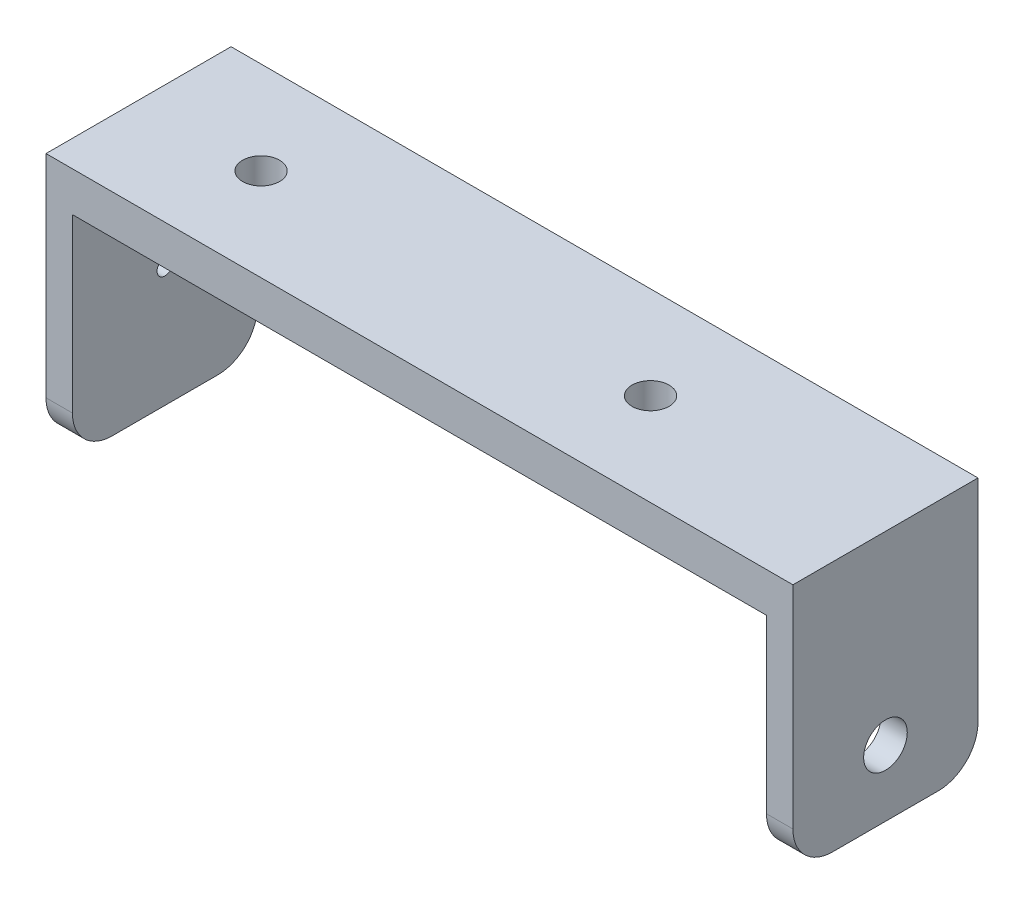
ISO-10303-21;
HEADER;
FILE_DESCRIPTION(('STEP AP214'),'2;1');
FILE_NAME('part.step','',(''),(''),'','','');
FILE_SCHEMA(('AUTOMOTIVE_DESIGN { 1 0 10303 214 1 1 1 1 }'));
ENDSEC;
DATA;
#1=APPLICATION_CONTEXT('core data for automotive mechanical design processes');
#2=APPLICATION_PROTOCOL_DEFINITION('international standard','automotive_design',2000,#1);
#3=PRODUCT_CONTEXT('',#1,'mechanical');
#4=PRODUCT('Part','Part','',(#3));
#5=PRODUCT_RELATED_PRODUCT_CATEGORY('part','',(#4));
#6=PRODUCT_DEFINITION_FORMATION('','',#4);
#7=PRODUCT_DEFINITION_CONTEXT('part definition',#1,'design');
#8=PRODUCT_DEFINITION('design','',#6,#7);
#9=PRODUCT_DEFINITION_SHAPE('','',#8);
#10=(LENGTH_UNIT() NAMED_UNIT(*) SI_UNIT(.MILLI.,.METRE.));
#11=(NAMED_UNIT(*) PLANE_ANGLE_UNIT() SI_UNIT($,.RADIAN.));
#12=(NAMED_UNIT(*) SI_UNIT($,.STERADIAN.) SOLID_ANGLE_UNIT());
#13=UNCERTAINTY_MEASURE_WITH_UNIT(LENGTH_MEASURE(1.E-05),#10,'distance_accuracy_value','');
#14=(GEOMETRIC_REPRESENTATION_CONTEXT(3) GLOBAL_UNCERTAINTY_ASSIGNED_CONTEXT((#13)) GLOBAL_UNIT_ASSIGNED_CONTEXT((#10,
#11,#12)) REPRESENTATION_CONTEXT('',''));
#15=CARTESIAN_POINT('',(0.,0.,0.));
#16=DIRECTION('',(0.,0.,1.));
#17=DIRECTION('',(1.,0.,0.));
#18=AXIS2_PLACEMENT_3D('',#15,#16,#17);
#19=CARTESIAN_POINT('',(0.,16.,14.));
#20=DIRECTION('',(0.,-1.,0.));
#21=DIRECTION('',(1.,0.,0.));
#22=AXIS2_PLACEMENT_3D('',#19,#20,#21);
#23=PLANE('',#22);
#24=CARTESIAN_POINT('',(-18.98,16.,7.));
#25=DIRECTION('',(0.,-1.,0.));
#26=DIRECTION('',(1.,0.,0.));
#27=AXIS2_PLACEMENT_3D('',#24,#25,#26);
#28=CIRCLE('',#27,1.4);
#29=CARTESIAN_POINT('',(-17.58,16.,7.));
#30=VERTEX_POINT('',#29);
#31=EDGE_CURVE('E297',#30,#30,#28,.T.);
#32=ORIENTED_EDGE('',*,*,#31,.F.);
#33=EDGE_LOOP('',(#32));
#34=FACE_BOUND('',#33,.T.);
#35=CARTESIAN_POINT('',(10.48,16.,7.));
#36=DIRECTION('',(0.,-1.,0.));
#37=DIRECTION('',(1.,0.,0.));
#38=AXIS2_PLACEMENT_3D('',#35,#36,#37);
#39=CIRCLE('',#38,1.4);
#40=CARTESIAN_POINT('',(11.88,16.,7.));
#41=VERTEX_POINT('',#40);
#42=EDGE_CURVE('E290',#41,#41,#39,.T.);
#43=ORIENTED_EDGE('',*,*,#42,.F.);
#44=EDGE_LOOP('',(#43));
#45=FACE_BOUND('',#44,.T.);
#46=DIRECTION('',(-1.,0.,0.));
#47=VECTOR('',#46,1.);
#48=CARTESIAN_POINT('',(0.,16.,0.));
#49=LINE('',#48,#47);
#50=CARTESIAN_POINT('',(26.25,16.,0.));
#51=VERTEX_POINT('',#50);
#52=CARTESIAN_POINT('',(-26.25,16.,0.));
#53=VERTEX_POINT('',#52);
#54=EDGE_CURVE('E156',#51,#53,#49,.T.);
#55=ORIENTED_EDGE('',*,*,#54,.F.);
#56=DIRECTION('',(0.,0.,-1.));
#57=VECTOR('',#56,1.);
#58=CARTESIAN_POINT('',(26.25,16.,14.));
#59=LINE('',#58,#57);
#60=CARTESIAN_POINT('',(26.25,16.,14.));
#61=VERTEX_POINT('',#60);
#62=EDGE_CURVE('E142',#61,#51,#59,.T.);
#63=ORIENTED_EDGE('',*,*,#62,.F.);
#64=DIRECTION('',(-1.,0.,0.));
#65=VECTOR('',#64,1.);
#66=CARTESIAN_POINT('',(0.,16.,14.));
#67=LINE('',#66,#65);
#68=CARTESIAN_POINT('',(-26.25,16.,14.));
#69=VERTEX_POINT('',#68);
#70=EDGE_CURVE('E150',#61,#69,#67,.T.);
#71=ORIENTED_EDGE('',*,*,#70,.T.);
#72=DIRECTION('',(0.,0.,-1.));
#73=VECTOR('',#72,1.);
#74=CARTESIAN_POINT('',(-26.25,16.,14.));
#75=LINE('',#74,#73);
#76=EDGE_CURVE('E186',#69,#53,#75,.T.);
#77=ORIENTED_EDGE('',*,*,#76,.T.);
#78=EDGE_LOOP('',(#55,#63,#71,#77));
#79=FACE_BOUND('',#78,.T.);
#80=ADVANCED_FACE('F43',(#34,#45,#79),#23,.T.);
#81=CARTESIAN_POINT('',(26.25,0.,14.));
#82=DIRECTION('',(-1.,0.,0.));
#83=DIRECTION('',(0.,0.,1.));
#84=AXIS2_PLACEMENT_3D('',#81,#82,#83);
#85=PLANE('',#84);
#86=CARTESIAN_POINT('',(26.25,5.00000000000001,7.));
#87=DIRECTION('',(-1.,0.,0.));
#88=DIRECTION('',(0.,0.,1.));
#89=AXIS2_PLACEMENT_3D('',#86,#87,#88);
#90=CIRCLE('',#89,1.65);
#91=CARTESIAN_POINT('',(26.25,5.00000000000001,8.65));
#92=VERTEX_POINT('',#91);
#93=EDGE_CURVE('E171',#92,#92,#90,.F.);
#94=ORIENTED_EDGE('',*,*,#93,.T.);
#95=EDGE_LOOP('',(#94));
#96=FACE_BOUND('',#95,.T.);
#97=DIRECTION('',(0.,0.,-1.));
#98=VECTOR('',#97,1.);
#99=CARTESIAN_POINT('',(26.25,0.,14.));
#100=LINE('',#99,#98);
#101=CARTESIAN_POINT('',(26.25,0.,11.));
#102=VERTEX_POINT('',#101);
#103=CARTESIAN_POINT('',(26.25,0.,3.));
#104=VERTEX_POINT('',#103);
#105=EDGE_CURVE('E159',#102,#104,#100,.T.);
#106=ORIENTED_EDGE('',*,*,#105,.F.);
#107=CARTESIAN_POINT('',(26.25,3.,11.));
#108=DIRECTION('',(-1.,0.,0.));
#109=DIRECTION('',(0.,0.,1.));
#110=AXIS2_PLACEMENT_3D('',#107,#108,#109);
#111=CIRCLE('',#110,3.);
#112=CARTESIAN_POINT('',(26.25,3.,14.));
#113=VERTEX_POINT('',#112);
#114=EDGE_CURVE('E144',#102,#113,#111,.T.);
#115=ORIENTED_EDGE('',*,*,#114,.T.);
#116=DIRECTION('',(0.,1.,0.));
#117=VECTOR('',#116,1.);
#118=CARTESIAN_POINT('',(26.25,0.,14.));
#119=LINE('',#118,#117);
#120=EDGE_CURVE('E137',#113,#61,#119,.T.);
#121=ORIENTED_EDGE('',*,*,#120,.T.);
#122=ORIENTED_EDGE('',*,*,#62,.T.);
#123=DIRECTION('',(0.,1.,0.));
#124=VECTOR('',#123,1.);
#125=CARTESIAN_POINT('',(26.25,0.,0.));
#126=LINE('',#125,#124);
#127=CARTESIAN_POINT('',(26.25,3.,0.));
#128=VERTEX_POINT('',#127);
#129=EDGE_CURVE('E189',#128,#51,#126,.T.);
#130=ORIENTED_EDGE('',*,*,#129,.F.);
#131=CARTESIAN_POINT('',(26.25,3.,3.));
#132=DIRECTION('',(-1.,0.,0.));
#133=DIRECTION('',(0.,0.,1.));
#134=AXIS2_PLACEMENT_3D('',#131,#132,#133);
#135=CIRCLE('',#134,3.);
#136=EDGE_CURVE('E231',#128,#104,#135,.T.);
#137=ORIENTED_EDGE('',*,*,#136,.T.);
#138=EDGE_LOOP('',(#106,#115,#121,#122,#130,#137));
#139=FACE_BOUND('',#138,.T.);
#140=ADVANCED_FACE('F140',(#96,#139),#85,.T.);
#141=CARTESIAN_POINT('',(0.,0.,14.));
#142=DIRECTION('',(0.,-1.,0.));
#143=DIRECTION('',(1.,0.,0.));
#144=AXIS2_PLACEMENT_3D('',#141,#142,#143);
#145=PLANE('',#144);
#146=DIRECTION('',(0.,0.,-1.));
#147=VECTOR('',#146,1.);
#148=CARTESIAN_POINT('',(28.25,0.,14.));
#149=LINE('',#148,#147);
#150=CARTESIAN_POINT('',(28.25,0.,11.));
#151=VERTEX_POINT('',#150);
#152=CARTESIAN_POINT('',(28.25,0.,3.));
#153=VERTEX_POINT('',#152);
#154=EDGE_CURVE('E218',#151,#153,#149,.T.);
#155=ORIENTED_EDGE('',*,*,#154,.F.);
#156=DIRECTION('',(-1.,0.,0.));
#157=VECTOR('',#156,1.);
#158=CARTESIAN_POINT('',(0.,0.,11.));
#159=LINE('',#158,#157);
#160=EDGE_CURVE('E227',#151,#102,#159,.T.);
#161=ORIENTED_EDGE('',*,*,#160,.T.);
#162=ORIENTED_EDGE('',*,*,#105,.T.);
#163=DIRECTION('',(-1.,0.,0.));
#164=VECTOR('',#163,1.);
#165=CARTESIAN_POINT('',(28.25,0.,3.));
#166=LINE('',#165,#164);
#167=EDGE_CURVE('E158',#104,#153,#166,.F.);
#168=ORIENTED_EDGE('',*,*,#167,.T.);
#169=EDGE_LOOP('',(#155,#161,#162,#168));
#170=FACE_BOUND('',#169,.T.);
#171=ADVANCED_FACE('F331',(#170),#145,.T.);
#172=CARTESIAN_POINT('',(28.25,0.,14.));
#173=DIRECTION('',(1.,0.,0.));
#174=DIRECTION('',(0.,1.,0.));
#175=AXIS2_PLACEMENT_3D('',#172,#173,#174);
#176=PLANE('',#175);
#177=CARTESIAN_POINT('',(28.25,5.00000000000001,7.));
#178=DIRECTION('',(1.,0.,0.));
#179=DIRECTION('',(0.,0.,-1.));
#180=AXIS2_PLACEMENT_3D('',#177,#178,#179);
#181=CIRCLE('',#180,1.65);
#182=CARTESIAN_POINT('',(28.25,5.00000000000001,5.35));
#183=VERTEX_POINT('',#182);
#184=EDGE_CURVE('E300',#183,#183,#181,.T.);
#185=ORIENTED_EDGE('',*,*,#184,.F.);
#186=EDGE_LOOP('',(#185));
#187=FACE_BOUND('',#186,.T.);
#188=DIRECTION('',(0.,-1.,0.));
#189=VECTOR('',#188,1.);
#190=CARTESIAN_POINT('',(28.25,0.,14.));
#191=LINE('',#190,#189);
#192=CARTESIAN_POINT('',(28.25,19.,14.));
#193=VERTEX_POINT('',#192);
#194=CARTESIAN_POINT('',(28.25,3.,14.));
#195=VERTEX_POINT('',#194);
#196=EDGE_CURVE('E149',#193,#195,#191,.T.);
#197=ORIENTED_EDGE('',*,*,#196,.T.);
#198=CARTESIAN_POINT('',(28.25,3.,11.));
#199=DIRECTION('',(1.,0.,0.));
#200=DIRECTION('',(0.,1.,0.));
#201=AXIS2_PLACEMENT_3D('',#198,#199,#200);
#202=CIRCLE('',#201,3.);
#203=EDGE_CURVE('E245',#195,#151,#202,.T.);
#204=ORIENTED_EDGE('',*,*,#203,.T.);
#205=ORIENTED_EDGE('',*,*,#154,.T.);
#206=CARTESIAN_POINT('',(28.25,3.,3.));
#207=DIRECTION('',(1.,0.,0.));
#208=DIRECTION('',(0.,1.,0.));
#209=AXIS2_PLACEMENT_3D('',#206,#207,#208);
#210=CIRCLE('',#209,3.);
#211=CARTESIAN_POINT('',(28.25,3.,0.));
#212=VERTEX_POINT('',#211);
#213=EDGE_CURVE('E242',#153,#212,#210,.T.);
#214=ORIENTED_EDGE('',*,*,#213,.T.);
#215=DIRECTION('',(0.,-1.,0.));
#216=VECTOR('',#215,1.);
#217=CARTESIAN_POINT('',(28.25,0.,0.));
#218=LINE('',#217,#216);
#219=CARTESIAN_POINT('',(28.25,19.,0.));
#220=VERTEX_POINT('',#219);
#221=EDGE_CURVE('E192',#220,#212,#218,.T.);
#222=ORIENTED_EDGE('',*,*,#221,.F.);
#223=DIRECTION('',(0.,0.,-1.));
#224=VECTOR('',#223,1.);
#225=CARTESIAN_POINT('',(28.25,19.,14.));
#226=LINE('',#225,#224);
#227=EDGE_CURVE('E215',#193,#220,#226,.T.);
#228=ORIENTED_EDGE('',*,*,#227,.F.);
#229=EDGE_LOOP('',(#197,#204,#205,#214,#222,#228));
#230=FACE_BOUND('',#229,.T.);
#231=ADVANCED_FACE('F371',(#187,#230),#176,.T.);
#232=CARTESIAN_POINT('',(0.,19.,14.));
#233=DIRECTION('',(0.,1.,0.));
#234=DIRECTION('',(0.,0.,1.));
#235=AXIS2_PLACEMENT_3D('',#232,#233,#234);
#236=PLANE('',#235);
#237=CARTESIAN_POINT('',(-18.98,19.,7.));
#238=DIRECTION('',(0.,1.,0.));
#239=DIRECTION('',(0.,0.,1.));
#240=AXIS2_PLACEMENT_3D('',#237,#238,#239);
#241=CIRCLE('',#240,1.4);
#242=CARTESIAN_POINT('',(-18.98,19.,8.4));
#243=VERTEX_POINT('',#242);
#244=EDGE_CURVE('E286',#243,#243,#241,.T.);
#245=ORIENTED_EDGE('',*,*,#244,.F.);
#246=EDGE_LOOP('',(#245));
#247=FACE_BOUND('',#246,.T.);
#248=CARTESIAN_POINT('',(10.48,19.,7.));
#249=DIRECTION('',(0.,1.,0.));
#250=DIRECTION('',(0.,0.,1.));
#251=AXIS2_PLACEMENT_3D('',#248,#249,#250);
#252=CIRCLE('',#251,1.4);
#253=CARTESIAN_POINT('',(10.48,19.,8.4));
#254=VERTEX_POINT('',#253);
#255=EDGE_CURVE('E276',#254,#254,#252,.T.);
#256=ORIENTED_EDGE('',*,*,#255,.F.);
#257=EDGE_LOOP('',(#256));
#258=FACE_BOUND('',#257,.T.);
#259=DIRECTION('',(1.,0.,0.));
#260=VECTOR('',#259,1.);
#261=CARTESIAN_POINT('',(0.,19.,0.));
#262=LINE('',#261,#260);
#263=CARTESIAN_POINT('',(-28.25,19.,0.));
#264=VERTEX_POINT('',#263);
#265=EDGE_CURVE('E196',#264,#220,#262,.T.);
#266=ORIENTED_EDGE('',*,*,#265,.F.);
#267=DIRECTION('',(0.,0.,-1.));
#268=VECTOR('',#267,1.);
#269=CARTESIAN_POINT('',(-28.25,19.,14.));
#270=LINE('',#269,#268);
#271=CARTESIAN_POINT('',(-28.25,19.,14.));
#272=VERTEX_POINT('',#271);
#273=EDGE_CURVE('E211',#272,#264,#270,.T.);
#274=ORIENTED_EDGE('',*,*,#273,.F.);
#275=DIRECTION('',(1.,0.,0.));
#276=VECTOR('',#275,1.);
#277=CARTESIAN_POINT('',(0.,19.,14.));
#278=LINE('',#277,#276);
#279=EDGE_CURVE('E177',#272,#193,#278,.T.);
#280=ORIENTED_EDGE('',*,*,#279,.T.);
#281=ORIENTED_EDGE('',*,*,#227,.T.);
#282=EDGE_LOOP('',(#266,#274,#280,#281));
#283=FACE_BOUND('',#282,.T.);
#284=ADVANCED_FACE('F360',(#247,#258,#283),#236,.T.);
#285=CARTESIAN_POINT('',(-28.25,0.,14.));
#286=DIRECTION('',(-1.,0.,0.));
#287=DIRECTION('',(0.,0.,1.));
#288=AXIS2_PLACEMENT_3D('',#285,#286,#287);
#289=PLANE('',#288);
#290=CARTESIAN_POINT('',(-28.25,9.08500000000001,7.));
#291=DIRECTION('',(-1.,0.,0.));
#292=DIRECTION('',(0.,0.,1.));
#293=AXIS2_PLACEMENT_3D('',#290,#291,#292);
#294=CIRCLE('',#293,0.6);
#295=CARTESIAN_POINT('',(-28.25,9.08500000000001,7.6));
#296=VERTEX_POINT('',#295);
#297=EDGE_CURVE('E270',#296,#296,#294,.T.);
#298=ORIENTED_EDGE('',*,*,#297,.F.);
#299=EDGE_LOOP('',(#298));
#300=FACE_BOUND('',#299,.T.);
#301=CARTESIAN_POINT('',(-28.25,13.085,7.));
#302=DIRECTION('',(-1.,0.,0.));
#303=DIRECTION('',(0.,0.,1.));
#304=AXIS2_PLACEMENT_3D('',#301,#302,#303);
#305=CIRCLE('',#304,0.6);
#306=CARTESIAN_POINT('',(-28.25,13.085,7.6));
#307=VERTEX_POINT('',#306);
#308=EDGE_CURVE('E278',#307,#307,#305,.T.);
#309=ORIENTED_EDGE('',*,*,#308,.F.);
#310=EDGE_LOOP('',(#309));
#311=FACE_BOUND('',#310,.T.);
#312=DIRECTION('',(0.,0.,-1.));
#313=VECTOR('',#312,1.);
#314=CARTESIAN_POINT('',(-28.25,0.,14.));
#315=LINE('',#314,#313);
#316=CARTESIAN_POINT('',(-28.25,0.,11.));
#317=VERTEX_POINT('',#316);
#318=CARTESIAN_POINT('',(-28.25,0.,3.));
#319=VERTEX_POINT('',#318);
#320=EDGE_CURVE('E207',#317,#319,#315,.T.);
#321=ORIENTED_EDGE('',*,*,#320,.F.);
#322=CARTESIAN_POINT('',(-28.25,2.99999999999996,11.));
#323=DIRECTION('',(-1.,0.,0.));
#324=DIRECTION('',(0.,0.,1.));
#325=AXIS2_PLACEMENT_3D('',#322,#323,#324);
#326=CIRCLE('',#325,3.);
#327=CARTESIAN_POINT('',(-28.25,2.99999999999996,14.));
#328=VERTEX_POINT('',#327);
#329=EDGE_CURVE('E257',#317,#328,#326,.T.);
#330=ORIENTED_EDGE('',*,*,#329,.T.);
#331=DIRECTION('',(0.,1.,0.));
#332=VECTOR('',#331,1.);
#333=CARTESIAN_POINT('',(-28.25,0.,14.));
#334=LINE('',#333,#332);
#335=EDGE_CURVE('E181',#328,#272,#334,.T.);
#336=ORIENTED_EDGE('',*,*,#335,.T.);
#337=ORIENTED_EDGE('',*,*,#273,.T.);
#338=DIRECTION('',(0.,1.,0.));
#339=VECTOR('',#338,1.);
#340=CARTESIAN_POINT('',(-28.25,0.,0.));
#341=LINE('',#340,#339);
#342=CARTESIAN_POINT('',(-28.25,2.99999999999996,0.));
#343=VERTEX_POINT('',#342);
#344=EDGE_CURVE('E168',#343,#264,#341,.T.);
#345=ORIENTED_EDGE('',*,*,#344,.F.);
#346=CARTESIAN_POINT('',(-28.25,2.99999999999996,3.));
#347=DIRECTION('',(-1.,0.,0.));
#348=DIRECTION('',(0.,0.,1.));
#349=AXIS2_PLACEMENT_3D('',#346,#347,#348);
#350=CIRCLE('',#349,3.);
#351=EDGE_CURVE('E69',#343,#319,#350,.T.);
#352=ORIENTED_EDGE('',*,*,#351,.T.);
#353=EDGE_LOOP('',(#321,#330,#336,#337,#345,#352));
#354=FACE_BOUND('',#353,.T.);
#355=ADVANCED_FACE('F354',(#300,#311,#354),#289,.T.);
#356=CARTESIAN_POINT('',(0.,0.,14.));
#357=DIRECTION('',(0.,-1.,0.));
#358=DIRECTION('',(1.,0.,0.));
#359=AXIS2_PLACEMENT_3D('',#356,#357,#358);
#360=PLANE('',#359);
#361=DIRECTION('',(0.,0.,-1.));
#362=VECTOR('',#361,1.);
#363=CARTESIAN_POINT('',(-26.25,0.,14.));
#364=LINE('',#363,#362);
#365=CARTESIAN_POINT('',(-26.25,0.,11.));
#366=VERTEX_POINT('',#365);
#367=CARTESIAN_POINT('',(-26.25,0.,3.));
#368=VERTEX_POINT('',#367);
#369=EDGE_CURVE('E204',#366,#368,#364,.T.);
#370=ORIENTED_EDGE('',*,*,#369,.F.);
#371=DIRECTION('',(-1.,0.,0.));
#372=VECTOR('',#371,1.);
#373=CARTESIAN_POINT('',(0.,0.,11.));
#374=LINE('',#373,#372);
#375=EDGE_CURVE('E251',#366,#317,#374,.T.);
#376=ORIENTED_EDGE('',*,*,#375,.T.);
#377=ORIENTED_EDGE('',*,*,#320,.T.);
#378=DIRECTION('',(-1.,0.,0.));
#379=VECTOR('',#378,1.);
#380=CARTESIAN_POINT('',(-26.25,0.,3.));
#381=LINE('',#380,#379);
#382=EDGE_CURVE('E248',#319,#368,#381,.F.);
#383=ORIENTED_EDGE('',*,*,#382,.T.);
#384=EDGE_LOOP('',(#370,#376,#377,#383));
#385=FACE_BOUND('',#384,.T.);
#386=ADVANCED_FACE('F384',(#385),#360,.T.);
#387=CARTESIAN_POINT('',(-26.25,0.,14.));
#388=DIRECTION('',(1.,0.,0.));
#389=DIRECTION('',(0.,1.,0.));
#390=AXIS2_PLACEMENT_3D('',#387,#388,#389);
#391=PLANE('',#390);
#392=CARTESIAN_POINT('',(-26.25,9.08500000000001,7.));
#393=DIRECTION('',(1.,0.,0.));
#394=DIRECTION('',(0.,1.,0.));
#395=AXIS2_PLACEMENT_3D('',#392,#393,#394);
#396=CIRCLE('',#395,0.6);
#397=CARTESIAN_POINT('',(-26.25,9.68500000000001,7.));
#398=VERTEX_POINT('',#397);
#399=EDGE_CURVE('E47',#398,#398,#396,.T.);
#400=ORIENTED_EDGE('',*,*,#399,.F.);
#401=EDGE_LOOP('',(#400));
#402=FACE_BOUND('',#401,.T.);
#403=CARTESIAN_POINT('',(-26.25,13.085,7.));
#404=DIRECTION('',(1.,0.,0.));
#405=DIRECTION('',(0.,1.,0.));
#406=AXIS2_PLACEMENT_3D('',#403,#404,#405);
#407=CIRCLE('',#406,0.6);
#408=CARTESIAN_POINT('',(-26.25,13.685,7.));
#409=VERTEX_POINT('',#408);
#410=EDGE_CURVE('E267',#409,#409,#407,.T.);
#411=ORIENTED_EDGE('',*,*,#410,.F.);
#412=EDGE_LOOP('',(#411));
#413=FACE_BOUND('',#412,.T.);
#414=DIRECTION('',(0.,-1.,0.));
#415=VECTOR('',#414,1.);
#416=CARTESIAN_POINT('',(-26.25,0.,14.));
#417=LINE('',#416,#415);
#418=CARTESIAN_POINT('',(-26.25,2.99999999999996,14.));
#419=VERTEX_POINT('',#418);
#420=EDGE_CURVE('E163',#69,#419,#417,.T.);
#421=ORIENTED_EDGE('',*,*,#420,.T.);
#422=CARTESIAN_POINT('',(-26.25,2.99999999999996,11.));
#423=DIRECTION('',(1.,0.,0.));
#424=DIRECTION('',(0.,1.,0.));
#425=AXIS2_PLACEMENT_3D('',#422,#423,#424);
#426=CIRCLE('',#425,3.);
#427=EDGE_CURVE('E262',#419,#366,#426,.T.);
#428=ORIENTED_EDGE('',*,*,#427,.T.);
#429=ORIENTED_EDGE('',*,*,#369,.T.);
#430=CARTESIAN_POINT('',(-26.25,2.99999999999996,3.));
#431=DIRECTION('',(1.,0.,0.));
#432=DIRECTION('',(0.,1.,0.));
#433=AXIS2_PLACEMENT_3D('',#430,#431,#432);
#434=CIRCLE('',#433,3.);
#435=CARTESIAN_POINT('',(-26.25,2.99999999999996,0.));
#436=VERTEX_POINT('',#435);
#437=EDGE_CURVE('E61',#368,#436,#434,.T.);
#438=ORIENTED_EDGE('',*,*,#437,.T.);
#439=DIRECTION('',(0.,-1.,0.));
#440=VECTOR('',#439,1.);
#441=CARTESIAN_POINT('',(-26.25,0.,0.));
#442=LINE('',#441,#440);
#443=EDGE_CURVE('E165',#53,#436,#442,.T.);
#444=ORIENTED_EDGE('',*,*,#443,.F.);
#445=ORIENTED_EDGE('',*,*,#76,.F.);
#446=EDGE_LOOP('',(#421,#428,#429,#438,#444,#445));
#447=FACE_BOUND('',#446,.T.);
#448=ADVANCED_FACE('F388',(#402,#413,#447),#391,.T.);
#449=CARTESIAN_POINT('',(0.,0.,14.));
#450=DIRECTION('',(0.,0.,1.));
#451=DIRECTION('',(1.,0.,0.));
#452=AXIS2_PLACEMENT_3D('',#449,#450,#451);
#453=PLANE('',#452);
#454=ORIENTED_EDGE('',*,*,#120,.F.);
#455=DIRECTION('',(-1.,0.,0.));
#456=VECTOR('',#455,1.);
#457=CARTESIAN_POINT('',(0.,3.,14.));
#458=LINE('',#457,#456);
#459=EDGE_CURVE('E239',#113,#195,#458,.F.);
#460=ORIENTED_EDGE('',*,*,#459,.T.);
#461=ORIENTED_EDGE('',*,*,#196,.F.);
#462=ORIENTED_EDGE('',*,*,#279,.F.);
#463=ORIENTED_EDGE('',*,*,#335,.F.);
#464=DIRECTION('',(-1.,0.,0.));
#465=VECTOR('',#464,1.);
#466=CARTESIAN_POINT('',(0.,3.,14.));
#467=LINE('',#466,#465);
#468=EDGE_CURVE('E236',#328,#419,#467,.F.);
#469=ORIENTED_EDGE('',*,*,#468,.T.);
#470=ORIENTED_EDGE('',*,*,#420,.F.);
#471=ORIENTED_EDGE('',*,*,#70,.F.);
#472=EDGE_LOOP('',(#454,#460,#461,#462,#463,#469,#470,#471));
#473=FACE_BOUND('',#472,.T.);
#474=ADVANCED_FACE('F161',(#473),#453,.T.);
#475=CARTESIAN_POINT('',(0.,0.,0.));
#476=DIRECTION('',(0.,0.,1.));
#477=DIRECTION('',(1.,0.,0.));
#478=AXIS2_PLACEMENT_3D('',#475,#476,#477);
#479=PLANE('',#478);
#480=ORIENTED_EDGE('',*,*,#443,.T.);
#481=DIRECTION('',(-1.,0.,0.));
#482=VECTOR('',#481,1.);
#483=CARTESIAN_POINT('',(-28.25,2.99999999999996,0.));
#484=LINE('',#483,#482);
#485=EDGE_CURVE('E11',#436,#343,#484,.T.);
#486=ORIENTED_EDGE('',*,*,#485,.T.);
#487=ORIENTED_EDGE('',*,*,#344,.T.);
#488=ORIENTED_EDGE('',*,*,#265,.T.);
#489=ORIENTED_EDGE('',*,*,#221,.T.);
#490=DIRECTION('',(-1.,0.,0.));
#491=VECTOR('',#490,1.);
#492=CARTESIAN_POINT('',(26.25,3.,0.));
#493=LINE('',#492,#491);
#494=EDGE_CURVE('E53',#212,#128,#493,.T.);
#495=ORIENTED_EDGE('',*,*,#494,.T.);
#496=ORIENTED_EDGE('',*,*,#129,.T.);
#497=ORIENTED_EDGE('',*,*,#54,.T.);
#498=EDGE_LOOP('',(#480,#486,#487,#488,#489,#495,#496,#497));
#499=FACE_BOUND('',#498,.T.);
#500=ADVANCED_FACE('F313',(#499),#479,.F.);
#501=CARTESIAN_POINT('',(21.5830952441688,5.00000000000001,7.));
#502=DIRECTION('',(1.,0.,0.));
#503=DIRECTION('',(0.,0.,-1.));
#504=AXIS2_PLACEMENT_3D('',#501,#502,#503);
#505=CYLINDRICAL_SURFACE('',#504,1.65);
#506=ORIENTED_EDGE('',*,*,#184,.T.);
#507=EDGE_LOOP('',(#506));
#508=FACE_BOUND('',#507,.T.);
#509=ORIENTED_EDGE('',*,*,#93,.F.);
#510=EDGE_LOOP('',(#509));
#511=FACE_BOUND('',#510,.T.);
#512=ADVANCED_FACE('F310',(#508,#511),#505,.F.);
#513=CARTESIAN_POINT('',(10.48,5.,7.));
#514=DIRECTION('',(0.,1.,0.));
#515=DIRECTION('',(0.,0.,1.));
#516=AXIS2_PLACEMENT_3D('',#513,#514,#515);
#517=CYLINDRICAL_SURFACE('',#516,1.4);
#518=ORIENTED_EDGE('',*,*,#42,.T.);
#519=EDGE_LOOP('',(#518));
#520=FACE_BOUND('',#519,.T.);
#521=ORIENTED_EDGE('',*,*,#255,.T.);
#522=EDGE_LOOP('',(#521));
#523=FACE_BOUND('',#522,.T.);
#524=ADVANCED_FACE('F312',(#520,#523),#517,.F.);
#525=CARTESIAN_POINT('',(-18.98,5.,7.));
#526=DIRECTION('',(0.,1.,0.));
#527=DIRECTION('',(0.,0.,1.));
#528=AXIS2_PLACEMENT_3D('',#525,#526,#527);
#529=CYLINDRICAL_SURFACE('',#528,1.4);
#530=ORIENTED_EDGE('',*,*,#31,.T.);
#531=EDGE_LOOP('',(#530));
#532=FACE_BOUND('',#531,.T.);
#533=ORIENTED_EDGE('',*,*,#244,.T.);
#534=EDGE_LOOP('',(#533));
#535=FACE_BOUND('',#534,.T.);
#536=ADVANCED_FACE('F319',(#532,#535),#529,.F.);
#537=CARTESIAN_POINT('',(0.,3.,11.));
#538=DIRECTION('',(-1.,0.,0.));
#539=DIRECTION('',(0.,-1.,0.));
#540=AXIS2_PLACEMENT_3D('',#537,#538,#539);
#541=CYLINDRICAL_SURFACE('',#540,3.);
#542=ORIENTED_EDGE('',*,*,#203,.F.);
#543=ORIENTED_EDGE('',*,*,#459,.F.);
#544=ORIENTED_EDGE('',*,*,#114,.F.);
#545=ORIENTED_EDGE('',*,*,#160,.F.);
#546=EDGE_LOOP('',(#542,#543,#544,#545));
#547=FACE_BOUND('',#546,.T.);
#548=ADVANCED_FACE('F337',(#547),#541,.T.);
#549=CARTESIAN_POINT('',(0.,3.,11.));
#550=DIRECTION('',(-1.,0.,0.));
#551=DIRECTION('',(0.,-1.,0.));
#552=AXIS2_PLACEMENT_3D('',#549,#550,#551);
#553=CYLINDRICAL_SURFACE('',#552,3.);
#554=ORIENTED_EDGE('',*,*,#427,.F.);
#555=ORIENTED_EDGE('',*,*,#468,.F.);
#556=ORIENTED_EDGE('',*,*,#329,.F.);
#557=ORIENTED_EDGE('',*,*,#375,.F.);
#558=EDGE_LOOP('',(#554,#555,#556,#557));
#559=FACE_BOUND('',#558,.T.);
#560=ADVANCED_FACE('F340',(#559),#553,.T.);
#561=CARTESIAN_POINT('',(0.,3.,3.));
#562=DIRECTION('',(1.,0.,0.));
#563=DIRECTION('',(0.,1.,0.));
#564=AXIS2_PLACEMENT_3D('',#561,#562,#563);
#565=CYLINDRICAL_SURFACE('',#564,3.);
#566=ORIENTED_EDGE('',*,*,#437,.F.);
#567=ORIENTED_EDGE('',*,*,#382,.F.);
#568=ORIENTED_EDGE('',*,*,#351,.F.);
#569=ORIENTED_EDGE('',*,*,#485,.F.);
#570=EDGE_LOOP('',(#566,#567,#568,#569));
#571=FACE_BOUND('',#570,.T.);
#572=ADVANCED_FACE('F343',(#571),#565,.T.);
#573=CARTESIAN_POINT('',(0.,3.,3.));
#574=DIRECTION('',(1.,0.,0.));
#575=DIRECTION('',(0.,1.,0.));
#576=AXIS2_PLACEMENT_3D('',#573,#574,#575);
#577=CYLINDRICAL_SURFACE('',#576,3.);
#578=ORIENTED_EDGE('',*,*,#213,.F.);
#579=ORIENTED_EDGE('',*,*,#167,.F.);
#580=ORIENTED_EDGE('',*,*,#136,.F.);
#581=ORIENTED_EDGE('',*,*,#494,.F.);
#582=EDGE_LOOP('',(#578,#579,#580,#581));
#583=FACE_BOUND('',#582,.T.);
#584=ADVANCED_FACE('F45',(#583),#577,.T.);
#585=CARTESIAN_POINT('',(-18.25,13.085,7.));
#586=DIRECTION('',(-1.,0.,0.));
#587=DIRECTION('',(0.,0.,1.));
#588=AXIS2_PLACEMENT_3D('',#585,#586,#587);
#589=CYLINDRICAL_SURFACE('',#588,0.6);
#590=ORIENTED_EDGE('',*,*,#410,.T.);
#591=EDGE_LOOP('',(#590));
#592=FACE_BOUND('',#591,.T.);
#593=ORIENTED_EDGE('',*,*,#308,.T.);
#594=EDGE_LOOP('',(#593));
#595=FACE_BOUND('',#594,.T.);
#596=ADVANCED_FACE('F349',(#592,#595),#589,.F.);
#597=CARTESIAN_POINT('',(-18.25,9.08500000000001,7.));
#598=DIRECTION('',(-1.,0.,0.));
#599=DIRECTION('',(0.,0.,1.));
#600=AXIS2_PLACEMENT_3D('',#597,#598,#599);
#601=CYLINDRICAL_SURFACE('',#600,0.6);
#602=ORIENTED_EDGE('',*,*,#399,.T.);
#603=EDGE_LOOP('',(#602));
#604=FACE_BOUND('',#603,.T.);
#605=ORIENTED_EDGE('',*,*,#297,.T.);
#606=EDGE_LOOP('',(#605));
#607=FACE_BOUND('',#606,.T.);
#608=ADVANCED_FACE('F450',(#604,#607),#601,.F.);
#609=CLOSED_SHELL('',(#80,#140,#171,#231,#284,#355,#386,#448,#474,#500,#512,#524,#536,#548,#560,
#572,#584,#596,#608));
#610=MANIFOLD_SOLID_BREP('B2',#609);
#611=ADVANCED_BREP_SHAPE_REPRESENTATION('',(#18,#610),#14);
#612=SHAPE_DEFINITION_REPRESENTATION(#9,#611);
ENDSEC;
END-ISO-10303-21;
